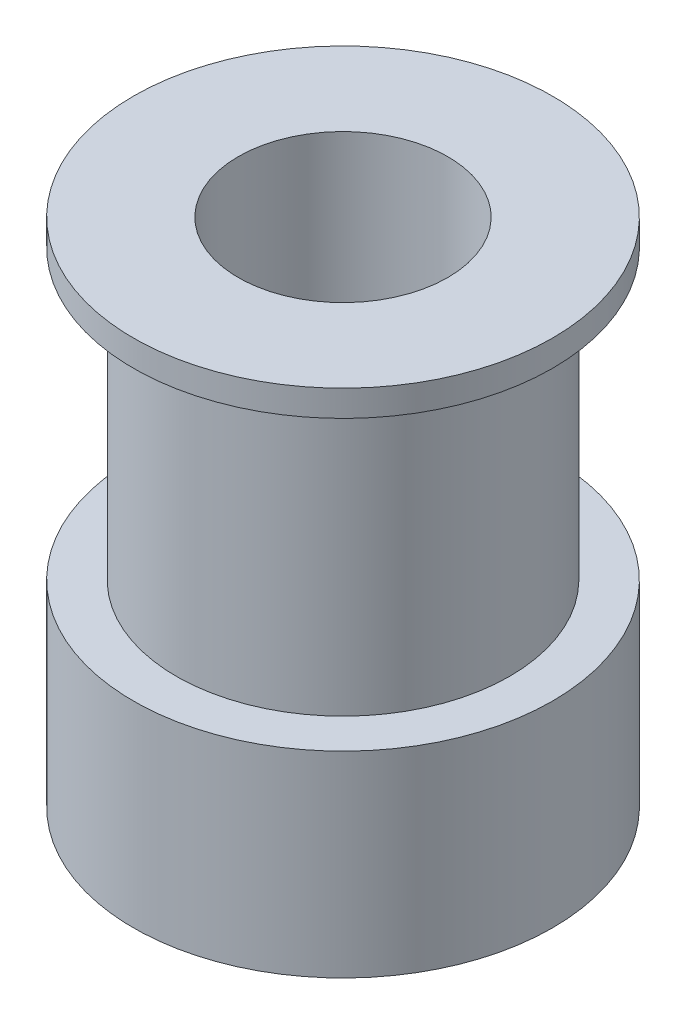
ISO-10303-21;
HEADER;
FILE_DESCRIPTION(('STEP AP214'),'2;1');
FILE_NAME('part.step','',(''),(''),'','','');
FILE_SCHEMA(('AUTOMOTIVE_DESIGN { 1 0 10303 214 1 1 1 1 }'));
ENDSEC;
DATA;
#1=APPLICATION_CONTEXT('core data for automotive mechanical design processes');
#2=APPLICATION_PROTOCOL_DEFINITION('international standard','automotive_design',2000,#1);
#3=PRODUCT_CONTEXT('',#1,'mechanical');
#4=PRODUCT('Part','Part','',(#3));
#5=PRODUCT_RELATED_PRODUCT_CATEGORY('part','',(#4));
#6=PRODUCT_DEFINITION_FORMATION('','',#4);
#7=PRODUCT_DEFINITION_CONTEXT('part definition',#1,'design');
#8=PRODUCT_DEFINITION('design','',#6,#7);
#9=PRODUCT_DEFINITION_SHAPE('','',#8);
#10=(LENGTH_UNIT() NAMED_UNIT(*) SI_UNIT(.MILLI.,.METRE.));
#11=(NAMED_UNIT(*) PLANE_ANGLE_UNIT() SI_UNIT($,.RADIAN.));
#12=(NAMED_UNIT(*) SI_UNIT($,.STERADIAN.) SOLID_ANGLE_UNIT());
#13=UNCERTAINTY_MEASURE_WITH_UNIT(LENGTH_MEASURE(1.E-05),#10,'distance_accuracy_value','');
#14=(GEOMETRIC_REPRESENTATION_CONTEXT(3) GLOBAL_UNCERTAINTY_ASSIGNED_CONTEXT((#13)) GLOBAL_UNIT_ASSIGNED_CONTEXT((#10,
#11,#12)) REPRESENTATION_CONTEXT('',''));
#15=CARTESIAN_POINT('',(0.,0.,0.));
#16=DIRECTION('',(0.,0.,1.));
#17=DIRECTION('',(1.,0.,0.));
#18=AXIS2_PLACEMENT_3D('',#15,#16,#17);
#19=CARTESIAN_POINT('',(3.43024899888577E-12,-1000.,0.));
#20=DIRECTION('',(0.,-1.,0.));
#21=DIRECTION('',(1.,0.,0.));
#22=AXIS2_PLACEMENT_3D('',#19,#20,#21);
#23=CYLINDRICAL_SURFACE('',#22,6.36500000000004);
#24=CARTESIAN_POINT('',(0.,7.50000000000006,0.));
#25=DIRECTION('',(0.,-1.,0.));
#26=DIRECTION('',(1.,0.,0.));
#27=AXIS2_PLACEMENT_3D('',#24,#25,#26);
#28=CIRCLE('',#27,6.36500000000003);
#29=CARTESIAN_POINT('',(6.365,7.50000000000008,0.));
#30=VERTEX_POINT('',#29);
#31=EDGE_CURVE('E85',#30,#30,#28,.T.);
#32=ORIENTED_EDGE('',*,*,#31,.F.);
#33=EDGE_LOOP('',(#32));
#34=FACE_BOUND('',#33,.T.);
#35=CARTESIAN_POINT('',(0.,18.5,0.));
#36=DIRECTION('',(0.,-1.,0.));
#37=DIRECTION('',(1.,0.,0.));
#38=AXIS2_PLACEMENT_3D('',#35,#36,#37);
#39=CIRCLE('',#38,6.36500000000006);
#40=CARTESIAN_POINT('',(6.365,18.5,0.));
#41=VERTEX_POINT('',#40);
#42=EDGE_CURVE('E10',#41,#41,#39,.T.);
#43=ORIENTED_EDGE('',*,*,#42,.T.);
#44=EDGE_LOOP('',(#43));
#45=FACE_BOUND('',#44,.T.);
#46=ADVANCED_FACE('F45',(#34,#45),#23,.T.);
#47=CARTESIAN_POINT('',(0.,18.5,0.));
#48=DIRECTION('',(0.,1.,0.));
#49=DIRECTION('',(-1.,0.,0.));
#50=AXIS2_PLACEMENT_3D('',#47,#48,#49);
#51=PLANE('',#50);
#52=ORIENTED_EDGE('',*,*,#42,.F.);
#53=EDGE_LOOP('',(#52));
#54=FACE_BOUND('',#53,.T.);
#55=CARTESIAN_POINT('',(0.,18.5,0.));
#56=DIRECTION('',(0.,-1.,0.));
#57=DIRECTION('',(1.,0.,0.));
#58=AXIS2_PLACEMENT_3D('',#55,#56,#57);
#59=CIRCLE('',#58,8.00000000000006);
#60=CARTESIAN_POINT('',(8.,18.5,0.));
#61=VERTEX_POINT('',#60);
#62=EDGE_CURVE('E58',#61,#61,#59,.T.);
#63=ORIENTED_EDGE('',*,*,#62,.T.);
#64=EDGE_LOOP('',(#63));
#65=FACE_BOUND('',#64,.T.);
#66=ADVANCED_FACE('F125',(#54,#65),#51,.F.);
#67=CARTESIAN_POINT('',(3.43024899888577E-12,-1000.,0.));
#68=DIRECTION('',(0.,-1.,0.));
#69=DIRECTION('',(1.,0.,0.));
#70=AXIS2_PLACEMENT_3D('',#67,#68,#69);
#71=CYLINDRICAL_SURFACE('',#70,8.00000000000001);
#72=CARTESIAN_POINT('',(0.,19.5000000000001,0.));
#73=DIRECTION('',(0.,-1.,0.));
#74=DIRECTION('',(1.,0.,0.));
#75=AXIS2_PLACEMENT_3D('',#72,#73,#74);
#76=CIRCLE('',#75,8.00000000000006);
#77=CARTESIAN_POINT('',(8.,19.5000000000001,0.));
#78=VERTEX_POINT('',#77);
#79=EDGE_CURVE('E63',#78,#78,#76,.T.);
#80=ORIENTED_EDGE('',*,*,#79,.T.);
#81=EDGE_LOOP('',(#80));
#82=FACE_BOUND('',#81,.T.);
#83=ORIENTED_EDGE('',*,*,#62,.F.);
#84=EDGE_LOOP('',(#83));
#85=FACE_BOUND('',#84,.T.);
#86=ADVANCED_FACE('F114',(#82,#85),#71,.T.);
#87=CARTESIAN_POINT('',(0.,19.5,0.));
#88=DIRECTION('',(0.,-1.,0.));
#89=DIRECTION('',(1.,0.,0.));
#90=AXIS2_PLACEMENT_3D('',#87,#88,#89);
#91=PLANE('',#90);
#92=ORIENTED_EDGE('',*,*,#79,.F.);
#93=EDGE_LOOP('',(#92));
#94=FACE_BOUND('',#93,.T.);
#95=CARTESIAN_POINT('',(0.,19.5000000000001,0.));
#96=DIRECTION('',(0.,-1.,0.));
#97=DIRECTION('',(1.,0.,0.));
#98=AXIS2_PLACEMENT_3D('',#95,#96,#97);
#99=CIRCLE('',#98,4.00000000000006);
#100=CARTESIAN_POINT('',(4.,19.5000000000001,0.));
#101=VERTEX_POINT('',#100);
#102=EDGE_CURVE('E69',#101,#101,#99,.T.);
#103=ORIENTED_EDGE('',*,*,#102,.T.);
#104=EDGE_LOOP('',(#103));
#105=FACE_BOUND('',#104,.T.);
#106=ADVANCED_FACE('F121',(#94,#105),#91,.F.);
#107=CARTESIAN_POINT('',(3.43024899888577E-12,-1000.,0.));
#108=DIRECTION('',(0.,-1.,0.));
#109=DIRECTION('',(1.,0.,0.));
#110=AXIS2_PLACEMENT_3D('',#107,#108,#109);
#111=CYLINDRICAL_SURFACE('',#110,4.00000000000003);
#112=CARTESIAN_POINT('',(1.5,3.49999999999997,-3.70809924354786));
#113=CARTESIAN_POINT('',(1.50000304106109,3.58100748372076,-3.70809640633809));
#114=CARTESIAN_POINT('',(1.49341597549487,3.66199492250361,-3.71078260240989));
#115=CARTESIAN_POINT('',(1.46736187895468,3.82152808291317,-3.7211615930497));
#116=CARTESIAN_POINT('',(1.44789523373263,3.90007387759499,-3.72885423767115));
#117=CARTESIAN_POINT('',(1.39689657610574,4.0523753716135,-3.74825480280903));
#118=CARTESIAN_POINT('',(1.36539347266348,4.12614205665106,-3.75995309569263));
#119=CARTESIAN_POINT('',(1.29131856742698,4.26737189681881,-3.78603134206601));
#120=CARTESIAN_POINT('',(1.24874344095039,4.33483315028249,-3.80041210067326));
#121=CARTESIAN_POINT('',(1.15146661374162,4.46489031162279,-3.83103574665716));
#122=CARTESIAN_POINT('',(1.09630381213306,4.52712852962937,-3.84733341923606));
#123=CARTESIAN_POINT('',(0.976395839778925,4.64172281467146,-3.8794975062855));
#124=CARTESIAN_POINT('',(0.911648630256679,4.69407677374183,-3.89536382814788));
#125=CARTESIAN_POINT('',(0.7716946551776,4.78913951229559,-3.92552873936556));
#126=CARTESIAN_POINT('',(0.696206947538027,4.83145947471583,-3.93975561223508));
#127=CARTESIAN_POINT('',(0.538555771965246,4.90265117252488,-3.9643800797385));
#128=CARTESIAN_POINT('',(0.456394630933535,4.93152757199195,-3.97477900217009));
#129=CARTESIAN_POINT('',(0.291489341676831,4.97375789577459,-3.99018697103443));
#130=CARTESIAN_POINT('',(0.208923197281595,4.98772762744043,-3.99540915214777));
#131=CARTESIAN_POINT('',(0.0424643637947844,5.00172120094496,-4.00064014107943));
#132=CARTESIAN_POINT('',(-0.0414278850628348,5.00174957761868,-4.00065064414905));
#133=CARTESIAN_POINT('',(-0.203743543064478,4.9882182385348,-3.99559265903898));
#134=CARTESIAN_POINT('',(-0.282232178266902,4.97533070205116,-3.99077541996686));
#135=CARTESIAN_POINT('',(-0.435839217984394,4.93746408477442,-3.97693274932266));
#136=CARTESIAN_POINT('',(-0.510957383430301,4.91248414773793,-3.96790701975581));
#137=CARTESIAN_POINT('',(-0.656989017303107,4.85082954832413,-3.94637769167534));
#138=CARTESIAN_POINT('',(-0.727825392287311,4.81398999473156,-3.9338253947008));
#139=CARTESIAN_POINT('',(-0.862486607957562,4.72980790307058,-3.90651310225283));
#140=CARTESIAN_POINT('',(-0.926309176932325,4.68246197698237,-3.89175239512844));
#141=CARTESIAN_POINT('',(-1.04909048680094,4.57537271371679,-3.8605252965582));
#142=CARTESIAN_POINT('',(-1.10754614526348,4.51506608434954,-3.84400963763886));
#143=CARTESIAN_POINT('',(-1.21370395569343,4.38540700667841,-3.81182460645726));
#144=CARTESIAN_POINT('',(-1.261403406929,4.31605229341333,-3.79615544748851));
#145=CARTESIAN_POINT('',(-1.34565611808152,4.16828053253715,-3.76712703500339));
#146=CARTESIAN_POINT('',(-1.38193847851831,4.0896965063139,-3.75382677150281));
#147=CARTESIAN_POINT('',(-1.44056464441501,3.9269037748324,-3.73172438629006));
#148=CARTESIAN_POINT('',(-1.46291620605595,3.84269822840628,-3.72291976205787));
#149=CARTESIAN_POINT('',(-1.49190191709668,3.67602403768402,-3.71139597222852));
#150=CARTESIAN_POINT('',(-1.49933521158966,3.59371589446383,-3.70836785241541));
#151=CARTESIAN_POINT('',(-1.50057885636272,3.42899064325823,-3.7078653952502));
#152=CARTESIAN_POINT('',(-1.49439261093762,3.3465735676475,-3.71038967003991));
#153=CARTESIAN_POINT('',(-1.46929733520157,3.18807007771229,-3.72039381629739));
#154=CARTESIAN_POINT('',(-1.45100618334224,3.11186886423531,-3.72763276216453));
#155=CARTESIAN_POINT('',(-1.40299774640637,2.96365205527978,-3.74596487046365));
#156=CARTESIAN_POINT('',(-1.37327812034623,2.89163732083184,-3.75705882250176));
#157=CARTESIAN_POINT('',(-1.30200292275278,2.75083556192376,-3.78236243116083));
#158=CARTESIAN_POINT('',(-1.26004545177046,2.68227070786263,-3.79667328892069));
#159=CARTESIAN_POINT('',(-1.16591317862479,2.55287101827393,-3.82662814294295));
#160=CARTESIAN_POINT('',(-1.11373463696434,2.49203902537534,-3.84227262594081));
#161=CARTESIAN_POINT('',(-0.996727340900935,2.37583162680487,-3.87433046553188));
#162=CARTESIAN_POINT('',(-0.931306341491058,2.32104659123122,-3.89072969357031));
#163=CARTESIAN_POINT('',(-0.791797471753147,2.22316163241053,-3.92149874963306));
#164=CARTESIAN_POINT('',(-0.717709573322669,2.18006174705413,-3.93586857107668));
#165=CARTESIAN_POINT('',(-0.563016329468472,2.10705394380036,-3.96094985704555));
#166=CARTESIAN_POINT('',(-0.482434433064622,2.07710087620737,-3.97167381338013));
#167=CARTESIAN_POINT('',(-0.31688188752325,2.03134358615005,-3.98829436712575));
#168=CARTESIAN_POINT('',(-0.231913320723589,2.01553271457757,-3.99419323299416));
#169=CARTESIAN_POINT('',(-0.0653355852738112,1.99922559724515,-4.00028407317077));
#170=CARTESIAN_POINT('',(0.0161807680608495,1.99789051694098,-4.00078860953767));
#171=CARTESIAN_POINT('',(0.178226786412428,2.00841515944537,-3.99684889809227));
#172=CARTESIAN_POINT('',(0.258756569245261,2.02027329088583,-3.99240524713133));
#173=CARTESIAN_POINT('',(0.41454824837713,2.05625885149359,-3.97921089603774));
#174=CARTESIAN_POINT('',(0.489890731068838,2.08007990587833,-3.9705679137802));
#175=CARTESIAN_POINT('',(0.635515473006394,2.13901001338434,-3.94987783620993));
#176=CARTESIAN_POINT('',(0.705796771275546,2.17412120330473,-3.93783009655667));
#177=CARTESIAN_POINT('',(0.842540176994416,2.25631394350479,-3.91090618300077));
#178=CARTESIAN_POINT('',(0.908717548846853,2.30383664051412,-3.89593240108832));
#179=CARTESIAN_POINT('',(1.03241734752336,2.40880783018758,-3.86499507694847));
#180=CARTESIAN_POINT('',(1.0899366712559,2.46625986580785,-3.8490311827403));
#181=CARTESIAN_POINT('',(1.19781214236196,2.59306413164504,-3.81688129739178));
#182=CARTESIAN_POINT('',(1.24762999816025,2.66288440215429,-3.80072805349163));
#183=CARTESIAN_POINT('',(1.33484709556844,2.8104158695733,-3.77098325003641));
#184=CARTESIAN_POINT('',(1.37224504878157,2.88812788405346,-3.75739195631219));
#185=CARTESIAN_POINT('',(1.4346588697426,3.05295568097538,-3.73402269853269));
#186=CARTESIAN_POINT('',(1.45906002899523,3.14033436651176,-3.72443803290863));
#187=CARTESIAN_POINT('',(1.49172356722079,3.31848527195576,-3.71147994336318));
#188=CARTESIAN_POINT('',(1.49999659339571,3.40925521270997,-3.70810242179739));
#189=CARTESIAN_POINT('',(1.5,3.49999999999997,-3.70809924354786));
#190=B_SPLINE_CURVE_WITH_KNOTS('',3,(#112,#113,#114,#115,#116,#117,#118,#119,#120,#121,#122,
#123,#124,#125,#126,#127,#128,#129,#130,#131,#132,#133,#134,#135,#136,#137,#138,#139,#140,#141,
#142,#143,#144,#145,#146,#147,#148,#149,#150,#151,#152,#153,#154,#155,#156,#157,#158,#159,#160,
#161,#162,#163,#164,#165,#166,#167,#168,#169,#170,#171,#172,#173,#174,#175,#176,#177,#178,#179,
#180,#181,#182,#183,#184,#185,#186,#187,#188,#189),.UNSPECIFIED.,.T.,.F.,(4,2,2,2,2,2,2,2,2,2,2,
2,2,2,2,2,2,2,2,2,2,2,2,2,2,2,2,2,2,2,2,2,2,2,2,2,2,2,4),(0.,0.242684541416171,
0.485361814598855,0.72745985675703,0.969630679682933,1.22274652401128,1.47591628822983,
1.73770072136421,1.9993942638133,2.24980018489679,2.50012465404857,2.73806472803194,
2.97602165263335,3.21744131210668,3.45893893628976,3.71456675065875,3.97025867827335,
4.23162592252966,4.49284751635474,4.73965657740485,4.98640395388884,5.22143845928199,
5.45652113429526,5.70041561005822,5.94439948466355,6.20385016993624,6.46330169650178,
6.72185508890169,6.98028685560127,7.22365720549936,7.4669982031948,7.70440274003891,
7.94185223512831,8.18928323676987,8.43680270894965,8.69738599542079,8.95799630544243,
9.23003178870926,9.50188762323053),.UNSPECIFIED.);
#191=CARTESIAN_POINT('',(1.5,3.49999999999997,-3.70809924354786));
#192=VERTEX_POINT('',#191);
#193=EDGE_CURVE('E89',#192,#192,#190,.T.);
#194=ORIENTED_EDGE('',*,*,#193,.F.);
#195=EDGE_LOOP('',(#194));
#196=FACE_BOUND('',#195,.T.);
#197=CARTESIAN_POINT('',(0.,0.,0.));
#198=DIRECTION('',(0.,-1.,0.));
#199=DIRECTION('',(1.,0.,0.));
#200=AXIS2_PLACEMENT_3D('',#197,#198,#199);
#201=CIRCLE('',#200,4.);
#202=CARTESIAN_POINT('',(4.,0.,0.));
#203=VERTEX_POINT('',#202);
#204=EDGE_CURVE('E73',#203,#203,#201,.T.);
#205=ORIENTED_EDGE('',*,*,#204,.T.);
#206=EDGE_LOOP('',(#205));
#207=FACE_BOUND('',#206,.T.);
#208=ORIENTED_EDGE('',*,*,#102,.F.);
#209=EDGE_LOOP('',(#208));
#210=FACE_BOUND('',#209,.T.);
#211=ADVANCED_FACE('F96',(#196,#207,#210),#111,.F.);
#212=CARTESIAN_POINT('',(0.,0.,0.));
#213=DIRECTION('',(0.,-1.,0.));
#214=DIRECTION('',(1.,0.,0.));
#215=AXIS2_PLACEMENT_3D('',#212,#213,#214);
#216=PLANE('',#215);
#217=CARTESIAN_POINT('',(0.,0.,0.));
#218=DIRECTION('',(0.,-1.,0.));
#219=DIRECTION('',(1.,0.,0.));
#220=AXIS2_PLACEMENT_3D('',#217,#218,#219);
#221=CIRCLE('',#220,8.);
#222=CARTESIAN_POINT('',(8.,0.,0.));
#223=VERTEX_POINT('',#222);
#224=EDGE_CURVE('E77',#223,#223,#221,.T.);
#225=ORIENTED_EDGE('',*,*,#224,.T.);
#226=EDGE_LOOP('',(#225));
#227=FACE_BOUND('',#226,.T.);
#228=ORIENTED_EDGE('',*,*,#204,.F.);
#229=EDGE_LOOP('',(#228));
#230=FACE_BOUND('',#229,.T.);
#231=ADVANCED_FACE('F112',(#227,#230),#216,.T.);
#232=CARTESIAN_POINT('',(1.5,3.49999999999997,-7.85811682275087));
#233=CARTESIAN_POINT('',(1.49999679883246,3.41654279198823,-7.85811843793495));
#234=CARTESIAN_POINT('',(1.49301126348936,3.33304405178158,-7.85946079760267));
#235=CARTESIAN_POINT('',(1.46527253251805,3.16840103841806,-7.86467851014365));
#236=CARTESIAN_POINT('',(1.44450765768477,3.0872588235725,-7.86855601173206));
#237=CARTESIAN_POINT('',(1.38987035617788,2.9297349286291,-7.87838976464885));
#238=CARTESIAN_POINT('',(1.35601013954374,2.85334889069268,-7.88434407905998));
#239=CARTESIAN_POINT('',(1.27617565760366,2.70734644071316,-7.8976582632096));
#240=CARTESIAN_POINT('',(1.23020233759193,2.63772950099667,-7.90501802325623));
#241=CARTESIAN_POINT('',(1.12683678942622,2.50636980080084,-7.92041614838945));
#242=CARTESIAN_POINT('',(1.06932292933092,2.44472351652824,-7.9284611662568));
#243=CARTESIAN_POINT('',(0.944771778803552,2.33189561040041,-7.94426457664035));
#244=CARTESIAN_POINT('',(0.877733863624945,2.28071467557518,-7.95202295031154));
#245=CARTESIAN_POINT('',(0.735403894570163,2.18990062339946,-7.96645017828406));
#246=CARTESIAN_POINT('',(0.660052840033866,2.15035846648055,-7.97311028052364));
#247=CARTESIAN_POINT('',(0.503631283250763,2.08453045772644,-7.98451608632932));
#248=CARTESIAN_POINT('',(0.422561251859506,2.05824351600975,-7.98926194728335));
#249=CARTESIAN_POINT('',(0.258002746187416,2.01997045138884,-7.99625755123779));
#250=CARTESIAN_POINT('',(0.174553323244858,2.00782169407729,-7.99853565976328));
#251=CARTESIAN_POINT('',(0.00677167603538373,1.99766311229957,-8.00043684615595));
#252=CARTESIAN_POINT('',(-0.0775604724476696,1.99965208386092,-8.00006015010698));
#253=CARTESIAN_POINT('',(-0.243598357899396,2.01758777114712,-7.99671633763242));
#254=CARTESIAN_POINT('',(-0.325323760451469,2.03335936942998,-7.99378172247215));
#255=CARTESIAN_POINT('',(-0.484947165715475,2.07813564939521,-7.98568826333562));
#256=CARTESIAN_POINT('',(-0.56284502882654,2.10714081334578,-7.98052933829967));
#257=CARTESIAN_POINT('',(-0.713110065751521,2.17772773105827,-7.9685126029734));
#258=CARTESIAN_POINT('',(-0.785443571838532,2.21937948791247,-7.96164537590827));
#259=CARTESIAN_POINT('',(-0.922159977214637,2.31402566907713,-7.94697147542851));
#260=CARTESIAN_POINT('',(-0.986542066910784,2.36702124688755,-7.93916470651165));
#261=CARTESIAN_POINT('',(-1.10656561896904,2.4838157029835,-7.92333513680568));
#262=CARTESIAN_POINT('',(-1.16205790757041,2.54776778390205,-7.91531085901623));
#263=CARTESIAN_POINT('',(-1.2615517185126,2.6841495312786,-7.90006508924622));
#264=CARTESIAN_POINT('',(-1.30555307271182,2.75657932176461,-7.89284360901352));
#265=CARTESIAN_POINT('',(-1.38085852224478,2.90805827070263,-7.88001893307123));
#266=CARTESIAN_POINT('',(-1.41214093645421,2.98711845719062,-7.87441850530263));
#267=CARTESIAN_POINT('',(-1.46093656975056,3.14950118412317,-7.86551242396691));
#268=CARTESIAN_POINT('',(-1.47845134901108,3.23282324046476,-7.86220651038621));
#269=CARTESIAN_POINT('',(-1.49899672649739,3.40001932885585,-7.85831520301007));
#270=CARTESIAN_POINT('',(-1.50224164285859,3.48386611556549,-7.85768955816138));
#271=CARTESIAN_POINT('',(-1.49472968881724,3.65090345508712,-7.85912191420842));
#272=CARTESIAN_POINT('',(-1.48397351086433,3.73409404014806,-7.86117978238612));
#273=CARTESIAN_POINT('',(-1.44894868195883,3.89675290305436,-7.86770980063206));
#274=CARTESIAN_POINT('',(-1.4247923858399,3.97624625262487,-7.8721618669088));
#275=CARTESIAN_POINT('',(-1.3637722437906,4.13005718973013,-7.8829613415662));
#276=CARTESIAN_POINT('',(-1.32690746128795,4.2043743953153,-7.88930888963282));
#277=CARTESIAN_POINT('',(-1.2410235311966,4.34666761904314,-7.90327577863686));
#278=CARTESIAN_POINT('',(-1.19186899639621,4.41456053786605,-7.91090895425317));
#279=CARTESIAN_POINT('',(-1.08298344344247,4.54121204021431,-7.92654811368102));
#280=CARTESIAN_POINT('',(-1.02325147433084,4.59996980155575,-7.93455413096495));
#281=CARTESIAN_POINT('',(-0.893949417870386,4.7074837635341,-7.95016624005947));
#282=CARTESIAN_POINT('',(-0.824258534095891,4.75609582660594,-7.95776555833306));
#283=CARTESIAN_POINT('',(-0.677574523040141,4.84092120617764,-7.97159404810352));
#284=CARTESIAN_POINT('',(-0.600581677038529,4.87713500002498,-7.97782327234726));
#285=CARTESIAN_POINT('',(-0.441877541578685,4.93592009786405,-7.98818057995849));
#286=CARTESIAN_POINT('',(-0.360193213078989,4.95856218756138,-7.99231954730143));
#287=CARTESIAN_POINT('',(-0.194096227381572,4.98978704828986,-7.99807642083746));
#288=CARTESIAN_POINT('',(-0.109683858215852,4.99837129866268,-7.99969459229934));
#289=CARTESIAN_POINT('',(0.0580907602505079,5.00118530151841,-8.00022227515442));
#290=CARTESIAN_POINT('',(0.141449307066267,4.9956327531295,-7.99917286625033));
#291=CARTESIAN_POINT('',(0.306023369279198,4.97080757223154,-7.99456866611704));
#292=CARTESIAN_POINT('',(0.387238905213688,4.95153507125576,-7.99101389890672));
#293=CARTESIAN_POINT('',(0.545106475595484,4.89990879261626,-7.98179837978046));
#294=CARTESIAN_POINT('',(0.621766319318223,4.86757818711897,-7.97614135981577));
#295=CARTESIAN_POINT('',(0.768605631316693,4.79077954634479,-7.96333372068772));
#296=CARTESIAN_POINT('',(0.83878466500327,4.74631069789332,-7.95618300146484));
#297=CARTESIAN_POINT('',(0.971755027780006,4.64574854555765,-7.94104779859942));
#298=CARTESIAN_POINT('',(1.03442623539053,4.58949796613827,-7.93305284591273));
#299=CARTESIAN_POINT('',(1.14951536065485,4.46729543750727,-7.91719633538834));
#300=CARTESIAN_POINT('',(1.2019308632478,4.40134120962625,-7.90933480936766));
#301=CARTESIAN_POINT('',(1.29547633945385,4.26087354529663,-7.89455577425927));
#302=CARTESIAN_POINT('',(1.33649740531872,4.18628656033234,-7.8876476728073));
#303=CARTESIAN_POINT('',(1.40536132423416,4.03117421002023,-7.87567084650034));
#304=CARTESIAN_POINT('',(1.43321661638912,3.95065453341059,-7.87060038649117));
#305=CARTESIAN_POINT('',(1.46929726596175,3.80824771193406,-7.86393016292126));
#306=CARTESIAN_POINT('',(1.4807910573985,3.74719427623803,-7.86176310717933));
#307=CARTESIAN_POINT('',(1.49614351076215,3.62410153157966,-7.85885585595505));
#308=CARTESIAN_POINT('',(1.50000238052127,3.56206224949965,-7.85811562163283));
#309=CARTESIAN_POINT('',(1.5,3.49999999999997,-7.85811682275087));
#310=B_SPLINE_CURVE_WITH_KNOTS('',3,(#232,#233,#234,#235,#236,#237,#238,#239,#240,#241,#242,
#243,#244,#245,#246,#247,#248,#249,#250,#251,#252,#253,#254,#255,#256,#257,#258,#259,#260,#261,
#262,#263,#264,#265,#266,#267,#268,#269,#270,#271,#272,#273,#274,#275,#276,#277,#278,#279,#280,
#281,#282,#283,#284,#285,#286,#287,#288,#289,#290,#291,#292,#293,#294,#295,#296,#297,#298,#299,
#300,#301,#302,#303,#304,#305,#306,#307,#308,#309),.UNSPECIFIED.,.T.,.F.,(4,2,2,2,2,2,2,2,2,2,2,
2,2,2,2,2,2,2,2,2,2,2,2,2,2,2,2,2,2,2,2,2,2,2,2,2,2,2,4),(0.,0.250144505793186,
0.500501302380393,0.750625227978432,1.00072963993908,1.25362335698691,1.50653367069315,
1.76137104348047,2.0161874593964,2.26804275460261,2.51987660200648,2.76855650598724,
3.01724547328424,3.26733691984219,3.51745380911785,3.77140614764064,4.025362201924,
4.27974936118266,4.53410768866487,4.78463248587075,5.03514489338718,5.28358792315368,
5.53204926624317,5.78337862654143,6.03473059394677,6.2894412549587,6.54414210821705,
6.79750269418683,7.0508366166733,7.30029300570138,7.54974700322167,7.79876026530357,
8.0477902135711,8.30038464008745,8.55303847730764,8.80803001818117,9.06278015749119,
9.24880307527214,9.43482092920425),.UNSPECIFIED.);
#311=CARTESIAN_POINT('',(1.5,3.49999999999997,-7.85811682275087));
#312=VERTEX_POINT('',#311);
#313=EDGE_CURVE('E48',#312,#312,#310,.T.);
#314=ORIENTED_EDGE('',*,*,#313,.F.);
#315=EDGE_LOOP('',(#314));
#316=FACE_BOUND('',#315,.T.);
#317=CARTESIAN_POINT('',(0.,7.50000000000006,0.));
#318=DIRECTION('',(0.,-1.,0.));
#319=DIRECTION('',(1.,0.,0.));
#320=AXIS2_PLACEMENT_3D('',#317,#318,#319);
#321=CIRCLE('',#320,8.00000000000002);
#322=CARTESIAN_POINT('',(8.,7.50000000000009,0.));
#323=VERTEX_POINT('',#322);
#324=EDGE_CURVE('E81',#323,#323,#321,.T.);
#325=ORIENTED_EDGE('',*,*,#324,.T.);
#326=EDGE_LOOP('',(#325));
#327=FACE_BOUND('',#326,.T.);
#328=ORIENTED_EDGE('',*,*,#224,.F.);
#329=EDGE_LOOP('',(#328));
#330=FACE_BOUND('',#329,.T.);
#331=ADVANCED_FACE('F108',(#316,#327,#330),#71,.T.);
#332=CARTESIAN_POINT('',(0.,7.49999999999998,0.));
#333=DIRECTION('',(0.,1.,0.));
#334=DIRECTION('',(-1.,0.,0.));
#335=AXIS2_PLACEMENT_3D('',#332,#333,#334);
#336=PLANE('',#335);
#337=ORIENTED_EDGE('',*,*,#31,.T.);
#338=EDGE_LOOP('',(#337));
#339=FACE_BOUND('',#338,.T.);
#340=ORIENTED_EDGE('',*,*,#324,.F.);
#341=EDGE_LOOP('',(#340));
#342=FACE_BOUND('',#341,.T.);
#343=ADVANCED_FACE('F104',(#339,#342),#336,.T.);
#344=CARTESIAN_POINT('',(0.,3.49999999999997,-10.));
#345=DIRECTION('',(0.,0.,1.));
#346=DIRECTION('',(1.,0.,0.));
#347=AXIS2_PLACEMENT_3D('',#344,#345,#346);
#348=CYLINDRICAL_SURFACE('',#347,1.5);
#349=ORIENTED_EDGE('',*,*,#193,.T.);
#350=EDGE_LOOP('',(#349));
#351=FACE_BOUND('',#350,.T.);
#352=ORIENTED_EDGE('',*,*,#313,.T.);
#353=EDGE_LOOP('',(#352));
#354=FACE_BOUND('',#353,.T.);
#355=ADVANCED_FACE('F100',(#351,#354),#348,.F.);
#356=CLOSED_SHELL('',(#46,#66,#86,#106,#211,#231,#331,#343,#355));
#357=MANIFOLD_SOLID_BREP('B2',#356);
#358=ADVANCED_BREP_SHAPE_REPRESENTATION('',(#18,#357),#14);
#359=SHAPE_DEFINITION_REPRESENTATION(#9,#358);
ENDSEC;
END-ISO-10303-21;
